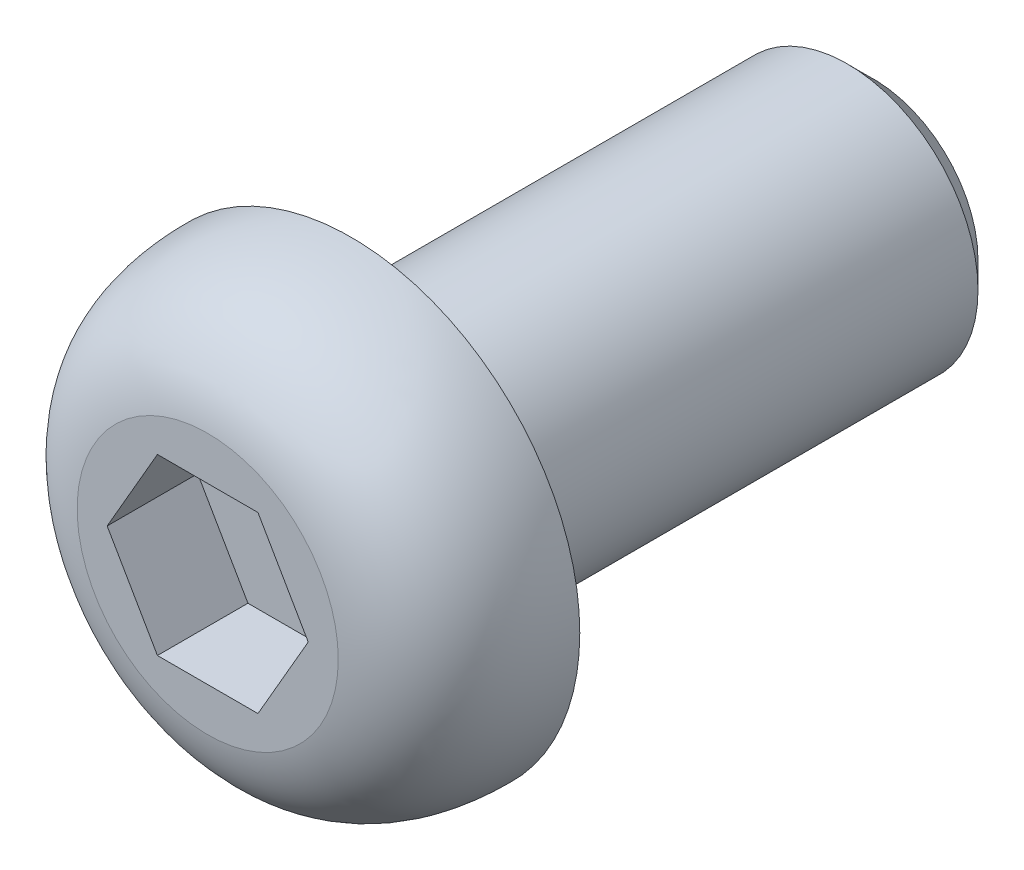
ISO-10303-21;
HEADER;
FILE_DESCRIPTION(('STEP AP214'),'2;1');
FILE_NAME('part.step','',(''),(''),'','','');
FILE_SCHEMA(('AUTOMOTIVE_DESIGN { 1 0 10303 214 1 1 1 1 }'));
ENDSEC;
DATA;
#1=APPLICATION_CONTEXT('core data for automotive mechanical design processes');
#2=APPLICATION_PROTOCOL_DEFINITION('international standard','automotive_design',2000,#1);
#3=PRODUCT_CONTEXT('',#1,'mechanical');
#4=PRODUCT('Part','Part','',(#3));
#5=PRODUCT_RELATED_PRODUCT_CATEGORY('part','',(#4));
#6=PRODUCT_DEFINITION_FORMATION('','',#4);
#7=PRODUCT_DEFINITION_CONTEXT('part definition',#1,'design');
#8=PRODUCT_DEFINITION('design','',#6,#7);
#9=PRODUCT_DEFINITION_SHAPE('','',#8);
#10=(LENGTH_UNIT() NAMED_UNIT(*) SI_UNIT(.MILLI.,.METRE.));
#11=(NAMED_UNIT(*) PLANE_ANGLE_UNIT() SI_UNIT($,.RADIAN.));
#12=(NAMED_UNIT(*) SI_UNIT($,.STERADIAN.) SOLID_ANGLE_UNIT());
#13=UNCERTAINTY_MEASURE_WITH_UNIT(LENGTH_MEASURE(1.E-05),#10,'distance_accuracy_value','');
#14=(GEOMETRIC_REPRESENTATION_CONTEXT(3) GLOBAL_UNCERTAINTY_ASSIGNED_CONTEXT((#13)) GLOBAL_UNIT_ASSIGNED_CONTEXT((#10,
#11,#12)) REPRESENTATION_CONTEXT('',''));
#15=CARTESIAN_POINT('',(0.,0.,0.));
#16=DIRECTION('',(0.,0.,1.));
#17=DIRECTION('',(1.,0.,0.));
#18=AXIS2_PLACEMENT_3D('',#15,#16,#17);
#19=CARTESIAN_POINT('',(0.,0.,1.22));
#20=DIRECTION('',(0.,0.,1.));
#21=DIRECTION('',(1.,0.,0.));
#22=AXIS2_PLACEMENT_3D('',#19,#20,#21);
#23=PLANE('',#22);
#24=DIRECTION('',(-0.50000000000019,0.866025403784329,0.));
#25=VECTOR('',#24,1.);
#26=CARTESIAN_POINT('',(2.31,0.,1.22));
#27=LINE('',#26,#25);
#28=CARTESIAN_POINT('',(2.31,0.,1.22));
#29=VERTEX_POINT('',#28);
#30=CARTESIAN_POINT('',(1.155,2.000518682742,1.22));
#31=VERTEX_POINT('',#30);
#32=EDGE_CURVE('E11',#29,#31,#27,.T.);
#33=ORIENTED_EDGE('',*,*,#32,.T.);
#34=DIRECTION('',(-1.,0.,0.));
#35=VECTOR('',#34,1.);
#36=CARTESIAN_POINT('',(1.155,2.000518682742,1.22));
#37=LINE('',#36,#35);
#38=CARTESIAN_POINT('',(-1.155,2.000518682742,1.22));
#39=VERTEX_POINT('',#38);
#40=EDGE_CURVE('E28',#31,#39,#37,.T.);
#41=ORIENTED_EDGE('',*,*,#40,.T.);
#42=DIRECTION('',(-0.50000000000019,-0.866025403784329,0.));
#43=VECTOR('',#42,1.);
#44=CARTESIAN_POINT('',(-1.155,2.000518682742,1.22));
#45=LINE('',#44,#43);
#46=CARTESIAN_POINT('',(-2.31,0.,1.22));
#47=VERTEX_POINT('',#46);
#48=EDGE_CURVE('E144',#39,#47,#45,.T.);
#49=ORIENTED_EDGE('',*,*,#48,.T.);
#50=DIRECTION('',(0.50000000000019,-0.866025403784329,0.));
#51=VECTOR('',#50,1.);
#52=CARTESIAN_POINT('',(-2.31,0.,1.22));
#53=LINE('',#52,#51);
#54=CARTESIAN_POINT('',(-1.155,-2.000518682742,1.22));
#55=VERTEX_POINT('',#54);
#56=EDGE_CURVE('E154',#47,#55,#53,.T.);
#57=ORIENTED_EDGE('',*,*,#56,.T.);
#58=DIRECTION('',(1.,0.,0.));
#59=VECTOR('',#58,1.);
#60=CARTESIAN_POINT('',(-1.155,-2.000518682742,1.22));
#61=LINE('',#60,#59);
#62=CARTESIAN_POINT('',(1.155,-2.000518682742,1.22));
#63=VERTEX_POINT('',#62);
#64=EDGE_CURVE('E101',#55,#63,#61,.T.);
#65=ORIENTED_EDGE('',*,*,#64,.T.);
#66=DIRECTION('',(0.50000000000019,0.866025403784329,0.));
#67=VECTOR('',#66,1.);
#68=CARTESIAN_POINT('',(1.155,-2.000518682742,1.22));
#69=LINE('',#68,#67);
#70=EDGE_CURVE('E185',#63,#29,#69,.T.);
#71=ORIENTED_EDGE('',*,*,#70,.T.);
#72=EDGE_LOOP('',(#33,#41,#49,#57,#65,#71));
#73=FACE_BOUND('',#72,.T.);
#74=ADVANCED_FACE('F17',(#73),#23,.T.);
#75=CARTESIAN_POINT('',(2.31,0.,1.22));
#76=DIRECTION('',(-0.866025403784329,-0.50000000000019,0.));
#77=DIRECTION('',(-0.50000000000019,0.866025403784329,0.));
#78=AXIS2_PLACEMENT_3D('',#75,#76,#77);
#79=PLANE('',#78);
#80=DIRECTION('',(0.,0.,1.));
#81=VECTOR('',#80,1.);
#82=CARTESIAN_POINT('',(2.31,0.,1.22));
#83=LINE('',#82,#81);
#84=CARTESIAN_POINT('',(2.31,0.,3.3));
#85=VERTEX_POINT('',#84);
#86=EDGE_CURVE('E178',#29,#85,#83,.T.);
#87=ORIENTED_EDGE('',*,*,#86,.T.);
#88=DIRECTION('',(-0.50000000000019,0.866025403784329,0.));
#89=VECTOR('',#88,1.);
#90=CARTESIAN_POINT('',(2.31,0.,3.3));
#91=LINE('',#90,#89);
#92=CARTESIAN_POINT('',(1.155,2.000518682742,3.3));
#93=VERTEX_POINT('',#92);
#94=EDGE_CURVE('E139',#85,#93,#91,.T.);
#95=ORIENTED_EDGE('',*,*,#94,.T.);
#96=DIRECTION('',(0.,0.,1.));
#97=VECTOR('',#96,1.);
#98=CARTESIAN_POINT('',(1.155,2.000518682742,1.22));
#99=LINE('',#98,#97);
#100=EDGE_CURVE('E148',#31,#93,#99,.T.);
#101=ORIENTED_EDGE('',*,*,#100,.F.);
#102=ORIENTED_EDGE('',*,*,#32,.F.);
#103=EDGE_LOOP('',(#87,#95,#101,#102));
#104=FACE_BOUND('',#103,.T.);
#105=ADVANCED_FACE('F235',(#104),#79,.T.);
#106=CARTESIAN_POINT('',(1.155,2.000518682742,1.22));
#107=DIRECTION('',(0.,-1.,0.));
#108=DIRECTION('',(-1.,0.,0.));
#109=AXIS2_PLACEMENT_3D('',#106,#107,#108);
#110=PLANE('',#109);
#111=ORIENTED_EDGE('',*,*,#100,.T.);
#112=DIRECTION('',(-1.,0.,0.));
#113=VECTOR('',#112,1.);
#114=CARTESIAN_POINT('',(1.155,2.000518682742,3.3));
#115=LINE('',#114,#113);
#116=CARTESIAN_POINT('',(-1.155,2.000518682742,3.3));
#117=VERTEX_POINT('',#116);
#118=EDGE_CURVE('E143',#93,#117,#115,.T.);
#119=ORIENTED_EDGE('',*,*,#118,.T.);
#120=DIRECTION('',(0.,0.,1.));
#121=VECTOR('',#120,1.);
#122=CARTESIAN_POINT('',(-1.155,2.000518682742,1.22));
#123=LINE('',#122,#121);
#124=EDGE_CURVE('E80',#39,#117,#123,.T.);
#125=ORIENTED_EDGE('',*,*,#124,.F.);
#126=ORIENTED_EDGE('',*,*,#40,.F.);
#127=EDGE_LOOP('',(#111,#119,#125,#126));
#128=FACE_BOUND('',#127,.T.);
#129=ADVANCED_FACE('F240',(#128),#110,.T.);
#130=CARTESIAN_POINT('',(-1.155,2.000518682742,1.22));
#131=DIRECTION('',(0.866025403784329,-0.50000000000019,0.));
#132=DIRECTION('',(0.,0.,-1.));
#133=AXIS2_PLACEMENT_3D('',#130,#131,#132);
#134=PLANE('',#133);
#135=ORIENTED_EDGE('',*,*,#124,.T.);
#136=DIRECTION('',(-0.50000000000019,-0.866025403784329,0.));
#137=VECTOR('',#136,1.);
#138=CARTESIAN_POINT('',(-1.155,2.000518682742,3.3));
#139=LINE('',#138,#137);
#140=CARTESIAN_POINT('',(-2.31,0.,3.3));
#141=VERTEX_POINT('',#140);
#142=EDGE_CURVE('E159',#117,#141,#139,.T.);
#143=ORIENTED_EDGE('',*,*,#142,.T.);
#144=DIRECTION('',(0.,0.,1.));
#145=VECTOR('',#144,1.);
#146=CARTESIAN_POINT('',(-2.31,0.,1.22));
#147=LINE('',#146,#145);
#148=EDGE_CURVE('E92',#47,#141,#147,.T.);
#149=ORIENTED_EDGE('',*,*,#148,.F.);
#150=ORIENTED_EDGE('',*,*,#48,.F.);
#151=EDGE_LOOP('',(#135,#143,#149,#150));
#152=FACE_BOUND('',#151,.T.);
#153=ADVANCED_FACE('F257',(#152),#134,.T.);
#154=CARTESIAN_POINT('',(-2.31,0.,1.22));
#155=DIRECTION('',(0.866025403784329,0.50000000000019,0.));
#156=DIRECTION('',(0.,0.,-1.));
#157=AXIS2_PLACEMENT_3D('',#154,#155,#156);
#158=PLANE('',#157);
#159=ORIENTED_EDGE('',*,*,#148,.T.);
#160=DIRECTION('',(0.50000000000019,-0.866025403784329,0.));
#161=VECTOR('',#160,1.);
#162=CARTESIAN_POINT('',(-2.31,0.,3.3));
#163=LINE('',#162,#161);
#164=CARTESIAN_POINT('',(-1.155,-2.000518682742,3.3));
#165=VERTEX_POINT('',#164);
#166=EDGE_CURVE('E160',#141,#165,#163,.T.);
#167=ORIENTED_EDGE('',*,*,#166,.T.);
#168=DIRECTION('',(0.,0.,1.));
#169=VECTOR('',#168,1.);
#170=CARTESIAN_POINT('',(-1.155,-2.000518682742,1.22));
#171=LINE('',#170,#169);
#172=EDGE_CURVE('E192',#55,#165,#171,.T.);
#173=ORIENTED_EDGE('',*,*,#172,.F.);
#174=ORIENTED_EDGE('',*,*,#56,.F.);
#175=EDGE_LOOP('',(#159,#167,#173,#174));
#176=FACE_BOUND('',#175,.T.);
#177=ADVANCED_FACE('F259',(#176),#158,.T.);
#178=CARTESIAN_POINT('',(-1.155,-2.000518682742,1.22));
#179=DIRECTION('',(0.,1.,0.));
#180=DIRECTION('',(1.,0.,0.));
#181=AXIS2_PLACEMENT_3D('',#178,#179,#180);
#182=PLANE('',#181);
#183=ORIENTED_EDGE('',*,*,#172,.T.);
#184=DIRECTION('',(1.,0.,0.));
#185=VECTOR('',#184,1.);
#186=CARTESIAN_POINT('',(-1.155,-2.000518682742,3.3));
#187=LINE('',#186,#185);
#188=CARTESIAN_POINT('',(1.155,-2.000518682742,3.3));
#189=VERTEX_POINT('',#188);
#190=EDGE_CURVE('E153',#165,#189,#187,.T.);
#191=ORIENTED_EDGE('',*,*,#190,.T.);
#192=DIRECTION('',(0.,0.,1.));
#193=VECTOR('',#192,1.);
#194=CARTESIAN_POINT('',(1.155,-2.000518682742,1.22));
#195=LINE('',#194,#193);
#196=EDGE_CURVE('E171',#63,#189,#195,.T.);
#197=ORIENTED_EDGE('',*,*,#196,.F.);
#198=ORIENTED_EDGE('',*,*,#64,.F.);
#199=EDGE_LOOP('',(#183,#191,#197,#198));
#200=FACE_BOUND('',#199,.T.);
#201=ADVANCED_FACE('F256',(#200),#182,.T.);
#202=CARTESIAN_POINT('',(1.155,-2.000518682742,1.22));
#203=DIRECTION('',(-0.866025403784329,0.50000000000019,0.));
#204=DIRECTION('',(0.,0.,1.));
#205=AXIS2_PLACEMENT_3D('',#202,#203,#204);
#206=PLANE('',#205);
#207=ORIENTED_EDGE('',*,*,#196,.T.);
#208=DIRECTION('',(0.50000000000019,0.866025403784329,0.));
#209=VECTOR('',#208,1.);
#210=CARTESIAN_POINT('',(1.155,-2.000518682742,3.3));
#211=LINE('',#210,#209);
#212=EDGE_CURVE('E142',#189,#85,#211,.T.);
#213=ORIENTED_EDGE('',*,*,#212,.T.);
#214=ORIENTED_EDGE('',*,*,#86,.F.);
#215=ORIENTED_EDGE('',*,*,#70,.F.);
#216=EDGE_LOOP('',(#207,#213,#214,#215));
#217=FACE_BOUND('',#216,.T.);
#218=ADVANCED_FACE('F248',(#217),#206,.T.);
#219=CARTESIAN_POINT('',(0.,0.,3.3));
#220=DIRECTION('',(0.,0.,1.));
#221=DIRECTION('',(1.,0.,0.));
#222=AXIS2_PLACEMENT_3D('',#219,#220,#221);
#223=PLANE('',#222);
#224=ORIENTED_EDGE('',*,*,#190,.F.);
#225=ORIENTED_EDGE('',*,*,#166,.F.);
#226=ORIENTED_EDGE('',*,*,#142,.F.);
#227=ORIENTED_EDGE('',*,*,#118,.F.);
#228=ORIENTED_EDGE('',*,*,#94,.F.);
#229=ORIENTED_EDGE('',*,*,#212,.F.);
#230=EDGE_LOOP('',(#224,#225,#226,#227,#228,#229));
#231=FACE_BOUND('',#230,.T.);
#232=CARTESIAN_POINT('',(0.,0.,3.3));
#233=DIRECTION('',(0.,0.,1.));
#234=DIRECTION('',(1.,0.,0.));
#235=AXIS2_PLACEMENT_3D('',#232,#233,#234);
#236=CIRCLE('',#235,3.);
#237=CARTESIAN_POINT('',(3.,0.,3.3));
#238=VERTEX_POINT('',#237);
#239=EDGE_CURVE('E149',#238,#238,#236,.T.);
#240=ORIENTED_EDGE('',*,*,#239,.T.);
#241=EDGE_LOOP('',(#240));
#242=FACE_BOUND('',#241,.T.);
#243=ADVANCED_FACE('F246',(#231,#242),#223,.T.);
#244=CARTESIAN_POINT('',(3.,0.,3.3));
#245=CARTESIAN_POINT('',(4.119491,0.,3.10996));
#246=CARTESIAN_POINT('',(5.263202,0.,2.328614));
#247=CARTESIAN_POINT('',(5.25,0.,0.));
#248=(BOUNDED_CURVE() B_SPLINE_CURVE(3,(#244,#245,#246,#247),.UNSPECIFIED.,.F.,
.F.) B_SPLINE_CURVE_WITH_KNOTS((4,4),(0.,1.),
.UNSPECIFIED.) CURVE() GEOMETRIC_REPRESENTATION_ITEM() RATIONAL_B_SPLINE_CURVE((1.,1.,1.,1.)) REPRESENTATION_ITEM(''));
#249=CARTESIAN_POINT('',(0.,0.,0.));
#250=DIRECTION('',(0.,0.,-1.));
#251=AXIS1_PLACEMENT('',#249,#250);
#252=SURFACE_OF_REVOLUTION('',#248,#251);
#253=CARTESIAN_POINT('',(3.,0.,3.3));
#254=CARTESIAN_POINT('',(4.119491,0.,3.10996));
#255=CARTESIAN_POINT('',(5.263202,0.,2.328614));
#256=CARTESIAN_POINT('',(5.25,0.,0.));
#257=(BOUNDED_CURVE() B_SPLINE_CURVE(3,(#253,#254,#255,#256),.UNSPECIFIED.,.F.,
.F.) B_SPLINE_CURVE_WITH_KNOTS((4,4),(0.,1.),
.UNSPECIFIED.) CURVE() GEOMETRIC_REPRESENTATION_ITEM() RATIONAL_B_SPLINE_CURVE((1.,1.,1.,1.)) REPRESENTATION_ITEM(''));
#258=CARTESIAN_POINT('',(5.25,0.,0.));
#259=VERTEX_POINT('',#258);
#260=EDGE_CURVE('E132',#238,#259,#257,.T.);
#261=ORIENTED_EDGE('',*,*,#260,.T.);
#262=CARTESIAN_POINT('',(0.,0.,0.));
#263=DIRECTION('',(0.,0.,1.));
#264=DIRECTION('',(1.,0.,0.));
#265=AXIS2_PLACEMENT_3D('',#262,#263,#264);
#266=CIRCLE('',#265,5.25);
#267=EDGE_CURVE('E125',#259,#259,#266,.T.);
#268=ORIENTED_EDGE('',*,*,#267,.T.);
#269=ORIENTED_EDGE('',*,*,#260,.F.);
#270=ORIENTED_EDGE('',*,*,#239,.F.);
#271=EDGE_LOOP('',(#261,#268,#269,#270));
#272=FACE_BOUND('',#271,.T.);
#273=ADVANCED_FACE('F243',(#272),#252,.T.);
#274=CARTESIAN_POINT('',(0.,0.,0.));
#275=DIRECTION('',(0.,0.,1.));
#276=DIRECTION('',(1.,0.,0.));
#277=AXIS2_PLACEMENT_3D('',#274,#275,#276);
#278=PLANE('',#277);
#279=ORIENTED_EDGE('',*,*,#267,.F.);
#280=EDGE_LOOP('',(#279));
#281=FACE_BOUND('',#280,.T.);
#282=CARTESIAN_POINT('',(0.,0.,0.));
#283=DIRECTION('',(0.,0.,1.));
#284=DIRECTION('',(1.,0.,0.));
#285=AXIS2_PLACEMENT_3D('',#282,#283,#284);
#286=CIRCLE('',#285,3.);
#287=CARTESIAN_POINT('',(3.,0.,0.));
#288=VERTEX_POINT('',#287);
#289=EDGE_CURVE('E122',#288,#288,#286,.T.);
#290=ORIENTED_EDGE('',*,*,#289,.T.);
#291=EDGE_LOOP('',(#290));
#292=FACE_BOUND('',#291,.T.);
#293=ADVANCED_FACE('F123',(#281,#292),#278,.F.);
#294=CARTESIAN_POINT('',(0.,0.,-11.4));
#295=DIRECTION('',(0.,0.,1.));
#296=DIRECTION('',(1.,0.,0.));
#297=AXIS2_PLACEMENT_3D('',#294,#295,#296);
#298=CYLINDRICAL_SURFACE('',#297,3.);
#299=CARTESIAN_POINT('',(0.,0.,-11.4));
#300=DIRECTION('',(0.,0.,1.));
#301=DIRECTION('',(1.,0.,0.));
#302=AXIS2_PLACEMENT_3D('',#299,#300,#301);
#303=CIRCLE('',#302,3.);
#304=CARTESIAN_POINT('',(3.,0.,-11.4));
#305=VERTEX_POINT('',#304);
#306=EDGE_CURVE('E135',#305,#305,#303,.T.);
#307=ORIENTED_EDGE('',*,*,#306,.T.);
#308=DIRECTION('',(0.,0.,1.));
#309=VECTOR('',#308,1.);
#310=CARTESIAN_POINT('',(3.,0.,-11.4));
#311=LINE('',#310,#309);
#312=EDGE_CURVE('E21',#305,#288,#311,.T.);
#313=ORIENTED_EDGE('',*,*,#312,.T.);
#314=ORIENTED_EDGE('',*,*,#289,.F.);
#315=ORIENTED_EDGE('',*,*,#312,.F.);
#316=EDGE_LOOP('',(#307,#313,#314,#315));
#317=FACE_BOUND('',#316,.T.);
#318=ADVANCED_FACE('F19',(#317),#298,.T.);
#319=CARTESIAN_POINT('',(0.,0.,-12.));
#320=DIRECTION('',(0.,0.,1.));
#321=DIRECTION('',(1.,0.,0.));
#322=AXIS2_PLACEMENT_3D('',#319,#320,#321);
#323=CONICAL_SURFACE('',#322,2.4,0.785398163397);
#324=CARTESIAN_POINT('',(0.,0.,-12.));
#325=DIRECTION('',(0.,0.,1.));
#326=DIRECTION('',(1.,0.,0.));
#327=AXIS2_PLACEMENT_3D('',#324,#325,#326);
#328=CIRCLE('',#327,2.4);
#329=CARTESIAN_POINT('',(2.4,0.,-12.));
#330=VERTEX_POINT('',#329);
#331=EDGE_CURVE('E167',#330,#330,#328,.T.);
#332=ORIENTED_EDGE('',*,*,#331,.T.);
#333=DIRECTION('',(0.707106781186548,0.,0.707106781186548));
#334=VECTOR('',#333,1.);
#335=CARTESIAN_POINT('',(2.4,0.,-12.));
#336=LINE('',#335,#334);
#337=EDGE_CURVE('E163',#330,#305,#336,.T.);
#338=ORIENTED_EDGE('',*,*,#337,.T.);
#339=ORIENTED_EDGE('',*,*,#306,.F.);
#340=ORIENTED_EDGE('',*,*,#337,.F.);
#341=EDGE_LOOP('',(#332,#338,#339,#340));
#342=FACE_BOUND('',#341,.T.);
#343=ADVANCED_FACE('F221',(#342),#323,.T.);
#344=CARTESIAN_POINT('',(0.,0.,-12.));
#345=DIRECTION('',(0.,0.,1.));
#346=DIRECTION('',(1.,0.,0.));
#347=AXIS2_PLACEMENT_3D('',#344,#345,#346);
#348=PLANE('',#347);
#349=ORIENTED_EDGE('',*,*,#331,.F.);
#350=EDGE_LOOP('',(#349));
#351=FACE_BOUND('',#350,.T.);
#352=ADVANCED_FACE('F224',(#351),#348,.F.);
#353=CLOSED_SHELL('',(#74,#105,#129,#153,#177,#201,#218,#243,#273,#293,#318,#343,#352));
#354=MANIFOLD_SOLID_BREP('B1',#353);
#355=ADVANCED_BREP_SHAPE_REPRESENTATION('',(#18,#354),#14);
#356=SHAPE_DEFINITION_REPRESENTATION(#9,#355);
ENDSEC;
END-ISO-10303-21;
